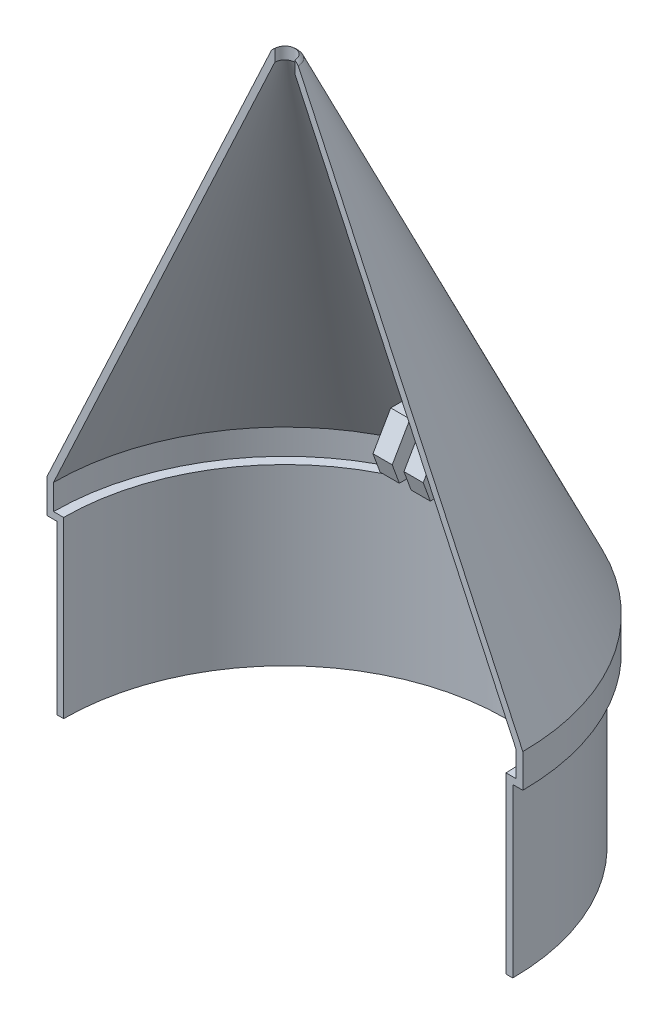
ISO-10303-21;
HEADER;
FILE_DESCRIPTION(('STEP AP214'),'2;1');
FILE_NAME('part.step','',(''),(''),'','','');
FILE_SCHEMA(('AUTOMOTIVE_DESIGN { 1 0 10303 214 1 1 1 1 }'));
ENDSEC;
DATA;
#1=APPLICATION_CONTEXT('core data for automotive mechanical design processes');
#2=APPLICATION_PROTOCOL_DEFINITION('international standard','automotive_design',2000,#1);
#3=PRODUCT_CONTEXT('',#1,'mechanical');
#4=PRODUCT('Part','Part','',(#3));
#5=PRODUCT_RELATED_PRODUCT_CATEGORY('part','',(#4));
#6=PRODUCT_DEFINITION_FORMATION('','',#4);
#7=PRODUCT_DEFINITION_CONTEXT('part definition',#1,'design');
#8=PRODUCT_DEFINITION('design','',#6,#7);
#9=PRODUCT_DEFINITION_SHAPE('','',#8);
#10=(LENGTH_UNIT() NAMED_UNIT(*) SI_UNIT(.MILLI.,.METRE.));
#11=(NAMED_UNIT(*) PLANE_ANGLE_UNIT() SI_UNIT($,.RADIAN.));
#12=(NAMED_UNIT(*) SI_UNIT($,.STERADIAN.) SOLID_ANGLE_UNIT());
#13=UNCERTAINTY_MEASURE_WITH_UNIT(LENGTH_MEASURE(1.E-05),#10,'distance_accuracy_value','');
#14=(GEOMETRIC_REPRESENTATION_CONTEXT(3) GLOBAL_UNCERTAINTY_ASSIGNED_CONTEXT((#13)) GLOBAL_UNIT_ASSIGNED_CONTEXT((#10,
#11,#12)) REPRESENTATION_CONTEXT('',''));
#15=CARTESIAN_POINT('',(0.,0.,0.));
#16=DIRECTION('',(0.,0.,1.));
#17=DIRECTION('',(1.,0.,0.));
#18=AXIS2_PLACEMENT_3D('',#15,#16,#17);
#19=CARTESIAN_POINT('',(7.5,40.,-39.0900744143344));
#20=DIRECTION('',(0.,-0.499999999999997,-0.86602540378444));
#21=DIRECTION('',(0.,0.86602540378444,-0.499999999999997));
#22=AXIS2_PLACEMENT_3D('',#19,#20,#21);
#23=PLANE('',#22);
#24=DIRECTION('',(0.,-0.86602540378444,0.499999999999997));
#25=VECTOR('',#24,1.);
#26=CARTESIAN_POINT('',(-1.75,40.,-39.0900744143344));
#27=LINE('',#26,#25);
#28=CARTESIAN_POINT('',(-1.75,40.,-39.0900744143344));
#29=VERTEX_POINT('',#28);
#30=CARTESIAN_POINT('',(-1.75,30.8217208581525,-33.7909924810913));
#31=VERTEX_POINT('',#30);
#32=EDGE_CURVE('E486',#29,#31,#27,.T.);
#33=ORIENTED_EDGE('',*,*,#32,.F.);
#34=DIRECTION('',(-1.,0.,0.));
#35=VECTOR('',#34,1.);
#36=CARTESIAN_POINT('',(7.5,40.,-39.0900744143344));
#37=LINE('',#36,#35);
#38=CARTESIAN_POINT('',(-7.5,40.,-39.0900744143344));
#39=VERTEX_POINT('',#38);
#40=EDGE_CURVE('E63',#29,#39,#37,.T.);
#41=ORIENTED_EDGE('',*,*,#40,.T.);
#42=DIRECTION('',(0.,-0.86602540378444,0.499999999999997));
#43=VECTOR('',#42,1.);
#44=CARTESIAN_POINT('',(-7.5,40.,-39.0900744143344));
#45=LINE('',#44,#43);
#46=CARTESIAN_POINT('',(-7.5,30.8217208581525,-33.7909924810913));
#47=VERTEX_POINT('',#46);
#48=EDGE_CURVE('E46',#39,#47,#45,.T.);
#49=ORIENTED_EDGE('',*,*,#48,.T.);
#50=DIRECTION('',(-1.,0.,0.));
#51=VECTOR('',#50,1.);
#52=CARTESIAN_POINT('',(7.5,30.8217208581525,-33.7909924810913));
#53=LINE('',#52,#51);
#54=EDGE_CURVE('E126',#31,#47,#53,.T.);
#55=ORIENTED_EDGE('',*,*,#54,.F.);
#56=EDGE_LOOP('',(#33,#41,#49,#55));
#57=FACE_BOUND('',#56,.T.);
#58=ADVANCED_FACE('F37',(#57),#23,.F.);
#59=CARTESIAN_POINT('',(7.5,30.8217208581525,-33.7909924810913));
#60=DIRECTION('',(0.,0.342020143325672,-0.939692620785907));
#61=DIRECTION('',(0.,0.939692620785907,0.342020143325672));
#62=AXIS2_PLACEMENT_3D('',#59,#60,#61);
#63=PLANE('',#62);
#64=DIRECTION('',(0.,-0.939692620785907,-0.342020143325672));
#65=VECTOR('',#64,1.);
#66=CARTESIAN_POINT('',(-1.75,30.8217208581525,-33.7909924810913));
#67=LINE('',#66,#65);
#68=CARTESIAN_POINT('',(-1.75,25.,-35.9099255856655));
#69=VERTEX_POINT('',#68);
#70=EDGE_CURVE('E492',#31,#69,#67,.T.);
#71=ORIENTED_EDGE('',*,*,#70,.F.);
#72=ORIENTED_EDGE('',*,*,#54,.T.);
#73=DIRECTION('',(0.,-0.939692620785907,-0.342020143325672));
#74=VECTOR('',#73,1.);
#75=CARTESIAN_POINT('',(-7.5,30.8217208581525,-33.7909924810913));
#76=LINE('',#75,#74);
#77=CARTESIAN_POINT('',(-7.5,25.,-35.9099255856655));
#78=VERTEX_POINT('',#77);
#79=EDGE_CURVE('E123',#47,#78,#76,.T.);
#80=ORIENTED_EDGE('',*,*,#79,.T.);
#81=DIRECTION('',(-1.,0.,0.));
#82=VECTOR('',#81,1.);
#83=CARTESIAN_POINT('',(7.5,25.,-35.9099255856655));
#84=LINE('',#83,#82);
#85=EDGE_CURVE('E107',#69,#78,#84,.T.);
#86=ORIENTED_EDGE('',*,*,#85,.F.);
#87=EDGE_LOOP('',(#71,#72,#80,#86));
#88=FACE_BOUND('',#87,.T.);
#89=ADVANCED_FACE('F124',(#88),#63,.F.);
#90=CARTESIAN_POINT('',(7.5,25.,-35.9099255856655));
#91=DIRECTION('',(0.,1.,0.));
#92=DIRECTION('',(0.,0.,1.));
#93=AXIS2_PLACEMENT_3D('',#90,#91,#92);
#94=PLANE('',#93);
#95=DIRECTION('',(0.,0.,-1.));
#96=VECTOR('',#95,1.);
#97=CARTESIAN_POINT('',(-1.75,25.,-35.9099255856655));
#98=LINE('',#97,#96);
#99=CARTESIAN_POINT('',(-1.75,25.,-40.9099255856655));
#100=VERTEX_POINT('',#99);
#101=EDGE_CURVE('E116',#69,#100,#98,.T.);
#102=ORIENTED_EDGE('',*,*,#101,.F.);
#103=ORIENTED_EDGE('',*,*,#85,.T.);
#104=DIRECTION('',(0.,0.,-1.));
#105=VECTOR('',#104,1.);
#106=CARTESIAN_POINT('',(-7.5,25.,-35.9099255856655));
#107=LINE('',#106,#105);
#108=CARTESIAN_POINT('',(-7.5,25.,-40.9099255856655));
#109=VERTEX_POINT('',#108);
#110=EDGE_CURVE('E112',#78,#109,#107,.T.);
#111=ORIENTED_EDGE('',*,*,#110,.T.);
#112=DIRECTION('',(-1.,0.,0.));
#113=VECTOR('',#112,1.);
#114=CARTESIAN_POINT('',(7.5,25.,-40.9099255856655));
#115=LINE('',#114,#113);
#116=EDGE_CURVE('E242',#100,#109,#115,.T.);
#117=ORIENTED_EDGE('',*,*,#116,.F.);
#118=EDGE_LOOP('',(#102,#103,#111,#117));
#119=FACE_BOUND('',#118,.T.);
#120=ADVANCED_FACE('F109',(#119),#94,.F.);
#121=CARTESIAN_POINT('',(7.5,25.,-40.9099255856655));
#122=DIRECTION('',(0.,-0.342020143325673,0.939692620785907));
#123=DIRECTION('',(0.,-0.939692620785907,-0.342020143325673));
#124=AXIS2_PLACEMENT_3D('',#121,#122,#123);
#125=PLANE('',#124);
#126=DIRECTION('',(0.,0.939692620785907,0.342020143325673));
#127=VECTOR('',#126,1.);
#128=CARTESIAN_POINT('',(1.75,25.,-40.9099255856655));
#129=LINE('',#128,#127);
#130=CARTESIAN_POINT('',(1.75,25.,-40.9099255856655));
#131=VERTEX_POINT('',#130);
#132=CARTESIAN_POINT('',(1.75,30.,-39.0900744143345));
#133=VERTEX_POINT('',#132);
#134=EDGE_CURVE('E457',#131,#133,#129,.T.);
#135=ORIENTED_EDGE('',*,*,#134,.T.);
#136=DIRECTION('',(-1.,0.,0.));
#137=VECTOR('',#136,1.);
#138=CARTESIAN_POINT('',(7.5,30.,-39.0900744143345));
#139=LINE('',#138,#137);
#140=CARTESIAN_POINT('',(7.5,30.,-39.0900744143345));
#141=VERTEX_POINT('',#140);
#142=EDGE_CURVE('E245',#141,#133,#139,.T.);
#143=ORIENTED_EDGE('',*,*,#142,.F.);
#144=DIRECTION('',(0.,0.939692620785907,0.342020143325673));
#145=VECTOR('',#144,1.);
#146=CARTESIAN_POINT('',(7.5,25.,-40.9099255856655));
#147=LINE('',#146,#145);
#148=CARTESIAN_POINT('',(7.5,25.,-40.9099255856655));
#149=VERTEX_POINT('',#148);
#150=EDGE_CURVE('E140',#149,#141,#147,.T.);
#151=ORIENTED_EDGE('',*,*,#150,.F.);
#152=EDGE_CURVE('E243',#149,#131,#115,.T.);
#153=ORIENTED_EDGE('',*,*,#152,.T.);
#154=EDGE_LOOP('',(#135,#143,#151,#153));
#155=FACE_BOUND('',#154,.T.);
#156=ADVANCED_FACE('F197',(#155),#125,.F.);
#157=CARTESIAN_POINT('',(0.,10.,0.));
#158=DIRECTION('',(0.,-1.,0.));
#159=DIRECTION('',(0.,0.,-1.));
#160=AXIS2_PLACEMENT_3D('',#157,#158,#159);
#161=CONICAL_SURFACE('',#160,71.,0.436332312998576);
#162=CARTESIAN_POINT('',(0.,10.,0.));
#163=DIRECTION('',(0.,-1.,0.));
#164=DIRECTION('',(0.,0.,-1.));
#165=AXIS2_PLACEMENT_3D('',#162,#163,#164);
#166=CIRCLE('',#165,71.);
#167=CARTESIAN_POINT('',(-71.,10.0000000000001,0.));
#168=VERTEX_POINT('',#167);
#169=CARTESIAN_POINT('',(71.,10.,0.));
#170=VERTEX_POINT('',#169);
#171=EDGE_CURVE('E442',#168,#170,#166,.T.);
#172=ORIENTED_EDGE('',*,*,#171,.F.);
#173=DIRECTION('',(-0.422618261740694,-0.906307787036652,0.));
#174=VECTOR('',#173,1.);
#175=CARTESIAN_POINT('',(-71.,10.0000000000001,0.));
#176=LINE('',#175,#174);
#177=CARTESIAN_POINT('',(-4.00000000000004,153.681963674143,0.));
#178=VERTEX_POINT('',#177);
#179=EDGE_CURVE('E341',#178,#168,#176,.T.);
#180=ORIENTED_EDGE('',*,*,#179,.F.);
#181=CARTESIAN_POINT('',(0.,153.681963674143,0.));
#182=DIRECTION('',(0.,-1.,0.));
#183=DIRECTION('',(0.,0.,-1.));
#184=AXIS2_PLACEMENT_3D('',#181,#182,#183);
#185=CIRCLE('',#184,4.);
#186=CARTESIAN_POINT('',(4.,153.681963674143,0.));
#187=VERTEX_POINT('',#186);
#188=EDGE_CURVE('E339',#178,#187,#185,.T.);
#189=ORIENTED_EDGE('',*,*,#188,.T.);
#190=DIRECTION('',(-0.422618261740694,0.906307787036652,0.));
#191=VECTOR('',#190,1.);
#192=CARTESIAN_POINT('',(4.,153.681963674143,0.));
#193=LINE('',#192,#191);
#194=EDGE_CURVE('E370',#170,#187,#193,.T.);
#195=ORIENTED_EDGE('',*,*,#194,.F.);
#196=EDGE_LOOP('',(#172,#180,#189,#195));
#197=FACE_BOUND('',#196,.T.);
#198=ADVANCED_FACE('F194',(#197),#161,.T.);
#199=CARTESIAN_POINT('',(0.,150.681963674143,0.));
#200=DIRECTION('',(0.,-1.,0.));
#201=DIRECTION('',(1.,0.,0.));
#202=AXIS2_PLACEMENT_3D('',#199,#200,#201);
#203=SPHERICAL_SURFACE('',#202,5.);
#204=ORIENTED_EDGE('',*,*,#188,.F.);
#205=CARTESIAN_POINT('',(0.,150.681963674143,0.));
#206=DIRECTION('',(0.,0.,1.));
#207=DIRECTION('',(1.,0.,0.));
#208=AXIS2_PLACEMENT_3D('',#205,#206,#207);
#209=CIRCLE('',#208,5.);
#210=CARTESIAN_POINT('',(-3.,154.681963674143,0.));
#211=VERTEX_POINT('',#210);
#212=EDGE_CURVE('E322',#211,#178,#209,.T.);
#213=ORIENTED_EDGE('',*,*,#212,.F.);
#214=CARTESIAN_POINT('',(0.,154.681963674143,0.));
#215=DIRECTION('',(0.,-1.,0.));
#216=DIRECTION('',(0.,0.,-1.));
#217=AXIS2_PLACEMENT_3D('',#214,#215,#216);
#218=CIRCLE('',#217,3.);
#219=CARTESIAN_POINT('',(3.,154.681963674143,0.));
#220=VERTEX_POINT('',#219);
#221=EDGE_CURVE('E337',#211,#220,#218,.T.);
#222=ORIENTED_EDGE('',*,*,#221,.T.);
#223=CARTESIAN_POINT('',(0.,150.681963674143,0.));
#224=DIRECTION('',(0.,0.,1.));
#225=DIRECTION('',(1.,0.,0.));
#226=AXIS2_PLACEMENT_3D('',#223,#224,#225);
#227=CIRCLE('',#226,5.);
#228=EDGE_CURVE('E340',#187,#220,#227,.T.);
#229=ORIENTED_EDGE('',*,*,#228,.F.);
#230=EDGE_LOOP('',(#204,#213,#222,#229));
#231=FACE_BOUND('',#230,.T.);
#232=ADVANCED_FACE('F196',(#231),#203,.T.);
#233=CARTESIAN_POINT('',(0.,9.15476347651861,0.));
#234=DIRECTION('',(0.,-1.,0.));
#235=DIRECTION('',(0.,0.,-1.));
#236=AXIS2_PLACEMENT_3D('',#233,#234,#235);
#237=CONICAL_SURFACE('',#236,69.1873844259267,0.436332312998576);
#238=CARTESIAN_POINT('',(0.,40.,0.));
#239=DIRECTION('',(0.,-1.,0.));
#240=DIRECTION('',(0.,0.,-1.));
#241=AXIS2_PLACEMENT_3D('',#238,#239,#240);
#242=CIRCLE('',#241,54.8040144174253);
#243=CARTESIAN_POINT('',(7.5,40.,-54.2883965158795));
#244=VERTEX_POINT('',#243);
#245=CARTESIAN_POINT('',(-7.5,40.,-54.2883965158795));
#246=VERTEX_POINT('',#245);
#247=EDGE_CURVE('E389',#244,#246,#242,.F.);
#248=ORIENTED_EDGE('',*,*,#247,.F.);
#249=CARTESIAN_POINT('',(7.5,71.6617471357174,-39.3312030396811));
#250=CARTESIAN_POINT('',(7.5,69.5429095750306,-40.3370124449023));
#251=CARTESIAN_POINT('',(7.5,67.4235666533207,-41.3417563847066));
#252=CARTESIAN_POINT('',(7.5,63.1840370711939,-43.3494614588628));
#253=CARTESIAN_POINT('',(7.5,61.0638504109723,-44.3524225936273));
#254=CARTESIAN_POINT('',(7.5,56.8228008436297,-46.356909944387));
#255=CARTESIAN_POINT('',(7.5,54.7019379369846,-47.3584361613897));
#256=CARTESIAN_POINT('',(7.5,50.4596494974675,-49.3602965685943));
#257=CARTESIAN_POINT('',(7.5,48.3382239645579,-50.3606307587166));
#258=CARTESIAN_POINT('',(7.5,41.9732550529254,-53.3601475533498));
#259=CARTESIAN_POINT('',(7.5,37.7290129380292,-55.3578474164361));
#260=CARTESIAN_POINT('',(7.5,29.2391956597101,-59.3504138622749));
#261=CARTESIAN_POINT('',(7.5,24.9936204960364,-61.3452804444937));
#262=CARTESIAN_POINT('',(7.5,18.4639218677366,-64.4113980588905));
#263=CARTESIAN_POINT('',(7.5,16.1801520127968,-65.4834022526316));
#264=CARTESIAN_POINT('',(7.5,11.6123630399049,-67.6268789781934));
#265=CARTESIAN_POINT('',(7.5,9.32834392197285,-68.698351510057));
#266=CARTESIAN_POINT('',(7.5,4.76008800791667,-70.840836880328));
#267=CARTESIAN_POINT('',(7.5,2.47585121163027,-71.9118497183893));
#268=CARTESIAN_POINT('',(7.5,-2.09281220832437,-74.053470877222));
#269=CARTESIAN_POINT('',(7.5,-4.37723883200638,-75.1240791979639));
#270=CARTESIAN_POINT('',(7.5,-6.66174713571736,-76.1945131729994));
#271=B_SPLINE_CURVE_WITH_KNOTS('',3,(#249,#250,#251,#252,#253,#254,#255,#256,#257,#258,#259,
#260,#261,#262,#263,#264,#265,#266,#267,#268,#269,#270),.UNSPECIFIED.,.F.,.F.,(4,2,2,2,2,2,2,2,
2,2,4),(0.,7.0363424264071,14.0726832244328,21.1090190805746,28.1453554066432,42.2180067470829,
56.2906607385882,63.8592259098191,71.4277904690593,78.9963607140983,86.5649315093623),.UNSPECIFIED.);
#272=CARTESIAN_POINT('',(7.5,30.,-58.9922445062094));
#273=VERTEX_POINT('',#272);
#274=EDGE_CURVE('E163',#244,#273,#271,.T.);
#275=ORIENTED_EDGE('',*,*,#274,.T.);
#276=CARTESIAN_POINT('',(0.,30.,0.));
#277=DIRECTION('',(0.,1.,0.));
#278=DIRECTION('',(0.,0.,1.));
#279=AXIS2_PLACEMENT_3D('',#276,#277,#278);
#280=CIRCLE('',#279,59.4670909989752);
#281=CARTESIAN_POINT('',(-7.5,30.,-58.9922445062094));
#282=VERTEX_POINT('',#281);
#283=EDGE_CURVE('E153',#282,#273,#280,.F.);
#284=ORIENTED_EDGE('',*,*,#283,.F.);
#285=CARTESIAN_POINT('',(-7.5,71.6617471357174,-39.3312030396811));
#286=CARTESIAN_POINT('',(-7.5,69.5429095750306,-40.3370124449023));
#287=CARTESIAN_POINT('',(-7.5,67.4235666533207,-41.3417563847066));
#288=CARTESIAN_POINT('',(-7.5,63.1840370711939,-43.3494614588628));
#289=CARTESIAN_POINT('',(-7.5,61.0638504109723,-44.3524225936273));
#290=CARTESIAN_POINT('',(-7.5,56.8228008436297,-46.356909944387));
#291=CARTESIAN_POINT('',(-7.5,54.7019379369846,-47.3584361613897));
#292=CARTESIAN_POINT('',(-7.5,50.4596494974675,-49.3602965685943));
#293=CARTESIAN_POINT('',(-7.5,48.3382239645579,-50.3606307587166));
#294=CARTESIAN_POINT('',(-7.5,41.9732550529254,-53.3601475533498));
#295=CARTESIAN_POINT('',(-7.5,37.7290129380292,-55.3578474164361));
#296=CARTESIAN_POINT('',(-7.5,29.2391956597101,-59.3504138622749));
#297=CARTESIAN_POINT('',(-7.5,24.9936204960364,-61.3452804444937));
#298=CARTESIAN_POINT('',(-7.5,18.4639218677366,-64.4113980588905));
#299=CARTESIAN_POINT('',(-7.5,16.1801520127968,-65.4834022526316));
#300=CARTESIAN_POINT('',(-7.5,11.6123630399049,-67.6268789781934));
#301=CARTESIAN_POINT('',(-7.5,9.32834392197285,-68.698351510057));
#302=CARTESIAN_POINT('',(-7.5,4.76008800791667,-70.840836880328));
#303=CARTESIAN_POINT('',(-7.5,2.47585121163027,-71.9118497183893));
#304=CARTESIAN_POINT('',(-7.5,-2.09281220832437,-74.053470877222));
#305=CARTESIAN_POINT('',(-7.5,-4.37723883200638,-75.1240791979639));
#306=CARTESIAN_POINT('',(-7.5,-6.66174713571736,-76.1945131729994));
#307=B_SPLINE_CURVE_WITH_KNOTS('',3,(#285,#286,#287,#288,#289,#290,#291,#292,#293,#294,#295,
#296,#297,#298,#299,#300,#301,#302,#303,#304,#305,#306),.UNSPECIFIED.,.F.,.F.,(4,2,2,2,2,2,2,2,
2,2,4),(0.,7.0363424264071,14.0726832244328,21.1090190805746,28.1453554066432,42.2180067470829,
56.2906607385882,63.8592259098191,71.4277904690593,78.9963607140983,86.5649315093623),.UNSPECIFIED.);
#308=EDGE_CURVE('E158',#246,#282,#307,.T.);
#309=ORIENTED_EDGE('',*,*,#308,.F.);
#310=EDGE_LOOP('',(#248,#275,#284,#309));
#311=FACE_BOUND('',#310,.T.);
#312=DIRECTION('',(-0.422618261740694,-0.906307787036653,0.));
#313=VECTOR('',#312,1.);
#314=CARTESIAN_POINT('',(0.,157.527588189876,0.));
#315=LINE('',#314,#313);
#316=CARTESIAN_POINT('',(-69.,9.55661067471414,0.));
#317=VERTEX_POINT('',#316);
#318=CARTESIAN_POINT('',(-3.,151.094067428347,0.));
#319=VERTEX_POINT('',#318);
#320=EDGE_CURVE('E325',#317,#319,#315,.F.);
#321=ORIENTED_EDGE('',*,*,#320,.F.);
#322=CARTESIAN_POINT('',(0.,9.55661067471413,0.));
#323=DIRECTION('',(0.,-1.,0.));
#324=DIRECTION('',(0.,0.,-1.));
#325=AXIS2_PLACEMENT_3D('',#322,#323,#324);
#326=CIRCLE('',#325,69.);
#327=CARTESIAN_POINT('',(69.,9.55661067471414,0.));
#328=VERTEX_POINT('',#327);
#329=EDGE_CURVE('E355',#317,#328,#326,.T.);
#330=ORIENTED_EDGE('',*,*,#329,.T.);
#331=DIRECTION('',(-0.422618261740694,0.906307787036653,0.));
#332=VECTOR('',#331,1.);
#333=CARTESIAN_POINT('',(0.,157.527588189876,0.));
#334=LINE('',#333,#332);
#335=CARTESIAN_POINT('',(3.,151.094067428347,0.));
#336=VERTEX_POINT('',#335);
#337=EDGE_CURVE('E368',#336,#328,#334,.F.);
#338=ORIENTED_EDGE('',*,*,#337,.F.);
#339=CARTESIAN_POINT('',(0.,151.094067428347,0.));
#340=DIRECTION('',(0.,-1.,0.));
#341=DIRECTION('',(0.,0.,-1.));
#342=AXIS2_PLACEMENT_3D('',#339,#340,#341);
#343=CIRCLE('',#342,3.);
#344=EDGE_CURVE('E345',#319,#336,#343,.T.);
#345=ORIENTED_EDGE('',*,*,#344,.F.);
#346=EDGE_LOOP('',(#321,#330,#338,#345));
#347=FACE_BOUND('',#346,.T.);
#348=ADVANCED_FACE('F182',(#311,#347),#237,.F.);
#349=CARTESIAN_POINT('',(0.,-50.,0.));
#350=DIRECTION('',(0.,-1.,0.));
#351=DIRECTION('',(0.,0.,-1.));
#352=AXIS2_PLACEMENT_3D('',#349,#350,#351);
#353=PLANE('',#352);
#354=CARTESIAN_POINT('',(0.,-50.,0.));
#355=DIRECTION('',(0.,-1.,0.));
#356=DIRECTION('',(0.,0.,-1.));
#357=AXIS2_PLACEMENT_3D('',#354,#355,#356);
#358=CIRCLE('',#357,68.);
#359=CARTESIAN_POINT('',(-68.,-50.,0.));
#360=VERTEX_POINT('',#359);
#361=CARTESIAN_POINT('',(68.,-50.,0.));
#362=VERTEX_POINT('',#361);
#363=EDGE_CURVE('E403',#360,#362,#358,.T.);
#364=ORIENTED_EDGE('',*,*,#363,.T.);
#365=DIRECTION('',(1.,0.,0.));
#366=VECTOR('',#365,1.);
#367=CARTESIAN_POINT('',(68.,-50.,0.));
#368=LINE('',#367,#366);
#369=CARTESIAN_POINT('',(66.,-50.,0.));
#370=VERTEX_POINT('',#369);
#371=EDGE_CURVE('E380',#370,#362,#368,.T.);
#372=ORIENTED_EDGE('',*,*,#371,.F.);
#373=CARTESIAN_POINT('',(0.,-50.,0.));
#374=DIRECTION('',(0.,-1.,0.));
#375=DIRECTION('',(0.,0.,-1.));
#376=AXIS2_PLACEMENT_3D('',#373,#374,#375);
#377=CIRCLE('',#376,66.);
#378=CARTESIAN_POINT('',(-66.,-50.,0.));
#379=VERTEX_POINT('',#378);
#380=EDGE_CURVE('E346',#379,#370,#377,.T.);
#381=ORIENTED_EDGE('',*,*,#380,.F.);
#382=EDGE_CURVE('E378',#360,#379,#368,.T.);
#383=ORIENTED_EDGE('',*,*,#382,.F.);
#384=EDGE_LOOP('',(#364,#372,#381,#383));
#385=FACE_BOUND('',#384,.T.);
#386=ADVANCED_FACE('F392',(#385),#353,.T.);
#387=CARTESIAN_POINT('',(0.,0.,0.));
#388=DIRECTION('',(0.,-1.,0.));
#389=DIRECTION('',(0.,0.,-1.));
#390=AXIS2_PLACEMENT_3D('',#387,#388,#389);
#391=CYLINDRICAL_SURFACE('',#390,71.);
#392=CARTESIAN_POINT('',(0.,0.,0.));
#393=DIRECTION('',(0.,-1.,0.));
#394=DIRECTION('',(0.,0.,-1.));
#395=AXIS2_PLACEMENT_3D('',#392,#393,#394);
#396=CIRCLE('',#395,71.);
#397=CARTESIAN_POINT('',(-71.,0.,0.));
#398=VERTEX_POINT('',#397);
#399=CARTESIAN_POINT('',(71.,0.,0.));
#400=VERTEX_POINT('',#399);
#401=EDGE_CURVE('E412',#398,#400,#396,.T.);
#402=ORIENTED_EDGE('',*,*,#401,.F.);
#403=DIRECTION('',(0.,-1.,0.));
#404=VECTOR('',#403,1.);
#405=CARTESIAN_POINT('',(-71.,0.,0.));
#406=LINE('',#405,#404);
#407=EDGE_CURVE('E385',#168,#398,#406,.T.);
#408=ORIENTED_EDGE('',*,*,#407,.F.);
#409=ORIENTED_EDGE('',*,*,#171,.T.);
#410=DIRECTION('',(0.,1.,0.));
#411=VECTOR('',#410,1.);
#412=CARTESIAN_POINT('',(71.,10.,0.));
#413=LINE('',#412,#411);
#414=EDGE_CURVE('E372',#400,#170,#413,.T.);
#415=ORIENTED_EDGE('',*,*,#414,.F.);
#416=EDGE_LOOP('',(#402,#408,#409,#415));
#417=FACE_BOUND('',#416,.T.);
#418=ADVANCED_FACE('F590',(#417),#391,.T.);
#419=CARTESIAN_POINT('',(68.,0.,0.));
#420=DIRECTION('',(0.,-1.,0.));
#421=DIRECTION('',(0.,0.,-1.));
#422=AXIS2_PLACEMENT_3D('',#419,#420,#421);
#423=PLANE('',#422);
#424=ORIENTED_EDGE('',*,*,#401,.T.);
#425=DIRECTION('',(1.,0.,0.));
#426=VECTOR('',#425,1.);
#427=CARTESIAN_POINT('',(71.,0.,0.));
#428=LINE('',#427,#426);
#429=CARTESIAN_POINT('',(68.,0.,0.));
#430=VERTEX_POINT('',#429);
#431=EDGE_CURVE('E374',#430,#400,#428,.T.);
#432=ORIENTED_EDGE('',*,*,#431,.F.);
#433=CARTESIAN_POINT('',(0.,0.,0.));
#434=DIRECTION('',(0.,-1.,0.));
#435=DIRECTION('',(0.,0.,-1.));
#436=AXIS2_PLACEMENT_3D('',#433,#434,#435);
#437=CIRCLE('',#436,68.);
#438=CARTESIAN_POINT('',(-68.,0.,0.));
#439=VERTEX_POINT('',#438);
#440=EDGE_CURVE('E405',#439,#430,#437,.T.);
#441=ORIENTED_EDGE('',*,*,#440,.F.);
#442=DIRECTION('',(1.,0.,0.));
#443=VECTOR('',#442,1.);
#444=CARTESIAN_POINT('',(-68.,0.,0.));
#445=LINE('',#444,#443);
#446=EDGE_CURVE('E383',#398,#439,#445,.T.);
#447=ORIENTED_EDGE('',*,*,#446,.F.);
#448=EDGE_LOOP('',(#424,#432,#441,#447));
#449=FACE_BOUND('',#448,.T.);
#450=ADVANCED_FACE('F437',(#449),#423,.T.);
#451=CARTESIAN_POINT('',(0.,0.,0.));
#452=DIRECTION('',(0.,-1.,0.));
#453=DIRECTION('',(0.,0.,-1.));
#454=AXIS2_PLACEMENT_3D('',#451,#452,#453);
#455=CYLINDRICAL_SURFACE('',#454,68.);
#456=ORIENTED_EDGE('',*,*,#363,.F.);
#457=DIRECTION('',(0.,-1.,0.));
#458=VECTOR('',#457,1.);
#459=CARTESIAN_POINT('',(-68.,-50.,0.));
#460=LINE('',#459,#458);
#461=EDGE_CURVE('E381',#439,#360,#460,.T.);
#462=ORIENTED_EDGE('',*,*,#461,.F.);
#463=ORIENTED_EDGE('',*,*,#440,.T.);
#464=DIRECTION('',(0.,1.,0.));
#465=VECTOR('',#464,1.);
#466=CARTESIAN_POINT('',(68.,0.,0.));
#467=LINE('',#466,#465);
#468=EDGE_CURVE('E376',#362,#430,#467,.T.);
#469=ORIENTED_EDGE('',*,*,#468,.F.);
#470=EDGE_LOOP('',(#456,#462,#463,#469));
#471=FACE_BOUND('',#470,.T.);
#472=ADVANCED_FACE('F431',(#471),#455,.T.);
#473=CARTESIAN_POINT('',(0.,0.,0.));
#474=DIRECTION('',(0.,-1.,0.));
#475=DIRECTION('',(0.,0.,-1.));
#476=AXIS2_PLACEMENT_3D('',#473,#474,#475);
#477=CYLINDRICAL_SURFACE('',#476,69.);
#478=DIRECTION('',(0.,-1.,0.));
#479=VECTOR('',#478,1.);
#480=CARTESIAN_POINT('',(-69.,0.,0.));
#481=LINE('',#480,#479);
#482=CARTESIAN_POINT('',(-69.,2.,0.));
#483=VERTEX_POINT('',#482);
#484=EDGE_CURVE('E359',#483,#317,#481,.F.);
#485=ORIENTED_EDGE('',*,*,#484,.F.);
#486=CARTESIAN_POINT('',(0.,2.,0.));
#487=DIRECTION('',(0.,-1.,0.));
#488=DIRECTION('',(0.,0.,-1.));
#489=AXIS2_PLACEMENT_3D('',#486,#487,#488);
#490=CIRCLE('',#489,69.);
#491=CARTESIAN_POINT('',(69.,2.,0.));
#492=VERTEX_POINT('',#491);
#493=EDGE_CURVE('E402',#483,#492,#490,.T.);
#494=ORIENTED_EDGE('',*,*,#493,.T.);
#495=DIRECTION('',(0.,-1.,0.));
#496=VECTOR('',#495,1.);
#497=CARTESIAN_POINT('',(69.,0.,0.));
#498=LINE('',#497,#496);
#499=EDGE_CURVE('E366',#328,#492,#498,.T.);
#500=ORIENTED_EDGE('',*,*,#499,.F.);
#501=ORIENTED_EDGE('',*,*,#329,.F.);
#502=EDGE_LOOP('',(#485,#494,#500,#501));
#503=FACE_BOUND('',#502,.T.);
#504=ADVANCED_FACE('F399',(#503),#477,.F.);
#505=CARTESIAN_POINT('',(68.,2.,0.));
#506=DIRECTION('',(0.,-1.,0.));
#507=DIRECTION('',(0.,0.,-1.));
#508=AXIS2_PLACEMENT_3D('',#505,#506,#507);
#509=PLANE('',#508);
#510=DIRECTION('',(-1.,0.,0.));
#511=VECTOR('',#510,1.);
#512=CARTESIAN_POINT('',(68.,2.,0.));
#513=LINE('',#512,#511);
#514=CARTESIAN_POINT('',(66.,2.,0.));
#515=VERTEX_POINT('',#514);
#516=EDGE_CURVE('E364',#492,#515,#513,.T.);
#517=ORIENTED_EDGE('',*,*,#516,.F.);
#518=ORIENTED_EDGE('',*,*,#493,.F.);
#519=CARTESIAN_POINT('',(-66.,2.,0.));
#520=VERTEX_POINT('',#519);
#521=EDGE_CURVE('E358',#520,#483,#513,.T.);
#522=ORIENTED_EDGE('',*,*,#521,.F.);
#523=CARTESIAN_POINT('',(0.,2.,0.));
#524=DIRECTION('',(0.,-1.,0.));
#525=DIRECTION('',(0.,0.,-1.));
#526=AXIS2_PLACEMENT_3D('',#523,#524,#525);
#527=CIRCLE('',#526,66.);
#528=EDGE_CURVE('E351',#520,#515,#527,.T.);
#529=ORIENTED_EDGE('',*,*,#528,.T.);
#530=EDGE_LOOP('',(#517,#518,#522,#529));
#531=FACE_BOUND('',#530,.T.);
#532=ADVANCED_FACE('F421',(#531),#509,.F.);
#533=CARTESIAN_POINT('',(0.,0.,0.));
#534=DIRECTION('',(0.,-1.,0.));
#535=DIRECTION('',(0.,0.,-1.));
#536=AXIS2_PLACEMENT_3D('',#533,#534,#535);
#537=CYLINDRICAL_SURFACE('',#536,66.);
#538=DIRECTION('',(0.,-1.,0.));
#539=VECTOR('',#538,1.);
#540=CARTESIAN_POINT('',(-66.,0.,0.));
#541=LINE('',#540,#539);
#542=EDGE_CURVE('E348',#379,#520,#541,.F.);
#543=ORIENTED_EDGE('',*,*,#542,.F.);
#544=ORIENTED_EDGE('',*,*,#380,.T.);
#545=DIRECTION('',(0.,-1.,0.));
#546=VECTOR('',#545,1.);
#547=CARTESIAN_POINT('',(66.,0.,0.));
#548=LINE('',#547,#546);
#549=EDGE_CURVE('E362',#515,#370,#548,.T.);
#550=ORIENTED_EDGE('',*,*,#549,.F.);
#551=ORIENTED_EDGE('',*,*,#528,.F.);
#552=EDGE_LOOP('',(#543,#544,#550,#551));
#553=FACE_BOUND('',#552,.T.);
#554=ADVANCED_FACE('F425',(#553),#537,.F.);
#555=CARTESIAN_POINT('',(0.,155.681963674143,0.));
#556=DIRECTION('',(0.,-1.,0.));
#557=DIRECTION('',(0.,0.,-1.));
#558=AXIS2_PLACEMENT_3D('',#555,#556,#557);
#559=CYLINDRICAL_SURFACE('',#558,3.);
#560=ORIENTED_EDGE('',*,*,#221,.F.);
#561=DIRECTION('',(0.,-1.,0.));
#562=VECTOR('',#561,1.);
#563=CARTESIAN_POINT('',(-3.,155.681963674143,0.));
#564=LINE('',#563,#562);
#565=EDGE_CURVE('E320',#211,#319,#564,.T.);
#566=ORIENTED_EDGE('',*,*,#565,.T.);
#567=ORIENTED_EDGE('',*,*,#344,.T.);
#568=DIRECTION('',(0.,-1.,0.));
#569=VECTOR('',#568,1.);
#570=CARTESIAN_POINT('',(3.,155.681963674143,0.));
#571=LINE('',#570,#569);
#572=EDGE_CURVE('E330',#336,#220,#571,.F.);
#573=ORIENTED_EDGE('',*,*,#572,.T.);
#574=EDGE_LOOP('',(#560,#566,#567,#573));
#575=FACE_BOUND('',#574,.T.);
#576=ADVANCED_FACE('F344',(#575),#559,.F.);
#577=CARTESIAN_POINT('',(0.,150.681963674143,0.));
#578=DIRECTION('',(0.,0.,1.));
#579=DIRECTION('',(1.,0.,0.));
#580=AXIS2_PLACEMENT_3D('',#577,#578,#579);
#581=PLANE('',#580);
#582=ORIENTED_EDGE('',*,*,#549,.T.);
#583=ORIENTED_EDGE('',*,*,#371,.T.);
#584=ORIENTED_EDGE('',*,*,#468,.T.);
#585=ORIENTED_EDGE('',*,*,#431,.T.);
#586=ORIENTED_EDGE('',*,*,#414,.T.);
#587=ORIENTED_EDGE('',*,*,#194,.T.);
#588=ORIENTED_EDGE('',*,*,#228,.T.);
#589=ORIENTED_EDGE('',*,*,#572,.F.);
#590=ORIENTED_EDGE('',*,*,#337,.T.);
#591=ORIENTED_EDGE('',*,*,#499,.T.);
#592=ORIENTED_EDGE('',*,*,#516,.T.);
#593=EDGE_LOOP('',(#582,#583,#584,#585,#586,#587,#588,#589,#590,#591,#592));
#594=FACE_BOUND('',#593,.T.);
#595=ADVANCED_FACE('F210',(#594),#581,.T.);
#596=ORIENTED_EDGE('',*,*,#542,.T.);
#597=ORIENTED_EDGE('',*,*,#521,.T.);
#598=ORIENTED_EDGE('',*,*,#484,.T.);
#599=ORIENTED_EDGE('',*,*,#320,.T.);
#600=ORIENTED_EDGE('',*,*,#565,.F.);
#601=ORIENTED_EDGE('',*,*,#212,.T.);
#602=ORIENTED_EDGE('',*,*,#179,.T.);
#603=ORIENTED_EDGE('',*,*,#407,.T.);
#604=ORIENTED_EDGE('',*,*,#446,.T.);
#605=ORIENTED_EDGE('',*,*,#461,.T.);
#606=ORIENTED_EDGE('',*,*,#382,.T.);
#607=EDGE_LOOP('',(#596,#597,#598,#599,#600,#601,#602,#603,#604,#605,#606));
#608=FACE_BOUND('',#607,.T.);
#609=ADVANCED_FACE('F204',(#608),#581,.T.);
#610=CARTESIAN_POINT('',(7.5,40.,-57.0107702553503));
#611=DIRECTION('',(0.,-1.,0.));
#612=DIRECTION('',(0.,0.,-1.));
#613=AXIS2_PLACEMENT_3D('',#610,#611,#612);
#614=PLANE('',#613);
#615=DIRECTION('',(1.,0.,0.));
#616=VECTOR('',#615,1.);
#617=CARTESIAN_POINT('',(-1.75,40.,-54.2883965158795));
#618=LINE('',#617,#616);
#619=CARTESIAN_POINT('',(-1.75,40.,-54.2883965158795));
#620=VERTEX_POINT('',#619);
#621=CARTESIAN_POINT('',(1.75,40.,-54.2883965158795));
#622=VERTEX_POINT('',#621);
#623=EDGE_CURVE('E550',#620,#622,#618,.T.);
#624=ORIENTED_EDGE('',*,*,#623,.T.);
#625=DIRECTION('',(0.,0.,1.));
#626=VECTOR('',#625,1.);
#627=CARTESIAN_POINT('',(1.75,40.,-54.2883965158795));
#628=LINE('',#627,#626);
#629=CARTESIAN_POINT('',(1.75,40.,-39.0900744143344));
#630=VERTEX_POINT('',#629);
#631=EDGE_CURVE('E450',#622,#630,#628,.T.);
#632=ORIENTED_EDGE('',*,*,#631,.T.);
#633=CARTESIAN_POINT('',(7.5,40.,-39.0900744143344));
#634=VERTEX_POINT('',#633);
#635=EDGE_CURVE('E165',#634,#630,#37,.T.);
#636=ORIENTED_EDGE('',*,*,#635,.F.);
#637=DIRECTION('',(0.,0.,1.));
#638=VECTOR('',#637,1.);
#639=CARTESIAN_POINT('',(7.5,40.,-57.0107702553503));
#640=LINE('',#639,#638);
#641=EDGE_CURVE('E87',#244,#634,#640,.T.);
#642=ORIENTED_EDGE('',*,*,#641,.F.);
#643=ORIENTED_EDGE('',*,*,#247,.T.);
#644=DIRECTION('',(0.,0.,1.));
#645=VECTOR('',#644,1.);
#646=CARTESIAN_POINT('',(-7.5,40.,-57.0107702553503));
#647=LINE('',#646,#645);
#648=EDGE_CURVE('E11',#246,#39,#647,.T.);
#649=ORIENTED_EDGE('',*,*,#648,.T.);
#650=ORIENTED_EDGE('',*,*,#40,.F.);
#651=DIRECTION('',(0.,0.,1.));
#652=VECTOR('',#651,1.);
#653=CARTESIAN_POINT('',(-1.75,40.,-54.2883965158795));
#654=LINE('',#653,#652);
#655=EDGE_CURVE('E493',#620,#29,#654,.T.);
#656=ORIENTED_EDGE('',*,*,#655,.F.);
#657=EDGE_LOOP('',(#624,#632,#636,#642,#643,#649,#650,#656));
#658=FACE_BOUND('',#657,.T.);
#659=ADVANCED_FACE('F202',(#658),#614,.F.);
#660=CARTESIAN_POINT('',(7.5,30.,-39.0900744143345));
#661=DIRECTION('',(0.,1.,0.));
#662=DIRECTION('',(0.,0.,1.));
#663=AXIS2_PLACEMENT_3D('',#660,#661,#662);
#664=PLANE('',#663);
#665=DIRECTION('',(1.,0.,0.));
#666=VECTOR('',#665,1.);
#667=CARTESIAN_POINT('',(-1.75,30.,-58.9922445062094));
#668=LINE('',#667,#666);
#669=CARTESIAN_POINT('',(-1.75,30.,-58.9922445062094));
#670=VERTEX_POINT('',#669);
#671=CARTESIAN_POINT('',(1.75,30.,-58.9922445062094));
#672=VERTEX_POINT('',#671);
#673=EDGE_CURVE('E331',#670,#672,#668,.T.);
#674=ORIENTED_EDGE('',*,*,#673,.F.);
#675=DIRECTION('',(0.,0.,-1.));
#676=VECTOR('',#675,1.);
#677=CARTESIAN_POINT('',(-1.75,30.,-39.0900744143345));
#678=LINE('',#677,#676);
#679=CARTESIAN_POINT('',(-1.75,30.,-39.0900744143345));
#680=VERTEX_POINT('',#679);
#681=EDGE_CURVE('E500',#680,#670,#678,.T.);
#682=ORIENTED_EDGE('',*,*,#681,.F.);
#683=CARTESIAN_POINT('',(-7.5,30.,-39.0900744143345));
#684=VERTEX_POINT('',#683);
#685=EDGE_CURVE('E96',#680,#684,#139,.T.);
#686=ORIENTED_EDGE('',*,*,#685,.T.);
#687=DIRECTION('',(0.,0.,-1.));
#688=VECTOR('',#687,1.);
#689=CARTESIAN_POINT('',(-7.5,30.,-39.0900744143345));
#690=LINE('',#689,#688);
#691=EDGE_CURVE('E135',#684,#282,#690,.T.);
#692=ORIENTED_EDGE('',*,*,#691,.T.);
#693=ORIENTED_EDGE('',*,*,#283,.T.);
#694=DIRECTION('',(0.,0.,-1.));
#695=VECTOR('',#694,1.);
#696=CARTESIAN_POINT('',(7.5,30.,-39.0900744143345));
#697=LINE('',#696,#695);
#698=EDGE_CURVE('E41',#141,#273,#697,.T.);
#699=ORIENTED_EDGE('',*,*,#698,.F.);
#700=ORIENTED_EDGE('',*,*,#142,.T.);
#701=DIRECTION('',(0.,0.,-1.));
#702=VECTOR('',#701,1.);
#703=CARTESIAN_POINT('',(1.75,30.,-39.0900744143345));
#704=LINE('',#703,#702);
#705=EDGE_CURVE('E54',#133,#672,#704,.T.);
#706=ORIENTED_EDGE('',*,*,#705,.T.);
#707=EDGE_LOOP('',(#674,#682,#686,#692,#693,#699,#700,#706));
#708=FACE_BOUND('',#707,.T.);
#709=ADVANCED_FACE('F39',(#708),#664,.F.);
#710=CARTESIAN_POINT('',(7.5,0.,0.));
#711=DIRECTION('',(1.,0.,0.));
#712=DIRECTION('',(0.,0.,-1.));
#713=AXIS2_PLACEMENT_3D('',#710,#711,#712);
#714=PLANE('',#713);
#715=ORIENTED_EDGE('',*,*,#274,.F.);
#716=ORIENTED_EDGE('',*,*,#641,.T.);
#717=DIRECTION('',(0.,-0.86602540378444,0.499999999999997));
#718=VECTOR('',#717,1.);
#719=CARTESIAN_POINT('',(7.5,40.,-39.0900744143344));
#720=LINE('',#719,#718);
#721=CARTESIAN_POINT('',(7.5,30.8217208581525,-33.7909924810913));
#722=VERTEX_POINT('',#721);
#723=EDGE_CURVE('E146',#634,#722,#720,.T.);
#724=ORIENTED_EDGE('',*,*,#723,.T.);
#725=DIRECTION('',(0.,-0.939692620785907,-0.342020143325672));
#726=VECTOR('',#725,1.);
#727=CARTESIAN_POINT('',(7.5,30.8217208581525,-33.7909924810913));
#728=LINE('',#727,#726);
#729=CARTESIAN_POINT('',(7.5,25.,-35.9099255856655));
#730=VERTEX_POINT('',#729);
#731=EDGE_CURVE('E144',#722,#730,#728,.T.);
#732=ORIENTED_EDGE('',*,*,#731,.T.);
#733=DIRECTION('',(0.,0.,-1.));
#734=VECTOR('',#733,1.);
#735=CARTESIAN_POINT('',(7.5,25.,-35.9099255856655));
#736=LINE('',#735,#734);
#737=EDGE_CURVE('E142',#730,#149,#736,.T.);
#738=ORIENTED_EDGE('',*,*,#737,.T.);
#739=ORIENTED_EDGE('',*,*,#150,.T.);
#740=ORIENTED_EDGE('',*,*,#698,.T.);
#741=EDGE_LOOP('',(#715,#716,#724,#732,#738,#739,#740));
#742=FACE_BOUND('',#741,.T.);
#743=ADVANCED_FACE('F191',(#742),#714,.T.);
#744=CARTESIAN_POINT('',(-7.5,0.,0.));
#745=DIRECTION('',(1.,0.,0.));
#746=DIRECTION('',(0.,0.,-1.));
#747=AXIS2_PLACEMENT_3D('',#744,#745,#746);
#748=PLANE('',#747);
#749=ORIENTED_EDGE('',*,*,#648,.F.);
#750=ORIENTED_EDGE('',*,*,#308,.T.);
#751=ORIENTED_EDGE('',*,*,#691,.F.);
#752=DIRECTION('',(0.,0.939692620785907,0.342020143325673));
#753=VECTOR('',#752,1.);
#754=CARTESIAN_POINT('',(-7.5,25.,-40.9099255856655));
#755=LINE('',#754,#753);
#756=EDGE_CURVE('E133',#109,#684,#755,.T.);
#757=ORIENTED_EDGE('',*,*,#756,.F.);
#758=ORIENTED_EDGE('',*,*,#110,.F.);
#759=ORIENTED_EDGE('',*,*,#79,.F.);
#760=ORIENTED_EDGE('',*,*,#48,.F.);
#761=EDGE_LOOP('',(#749,#750,#751,#757,#758,#759,#760));
#762=FACE_BOUND('',#761,.T.);
#763=ADVANCED_FACE('F131',(#762),#748,.F.);
#764=ORIENTED_EDGE('',*,*,#635,.T.);
#765=DIRECTION('',(0.,-0.86602540378444,0.499999999999997));
#766=VECTOR('',#765,1.);
#767=CARTESIAN_POINT('',(1.75,40.,-39.0900744143344));
#768=LINE('',#767,#766);
#769=CARTESIAN_POINT('',(1.75,30.8217208581525,-33.7909924810913));
#770=VERTEX_POINT('',#769);
#771=EDGE_CURVE('E235',#630,#770,#768,.T.);
#772=ORIENTED_EDGE('',*,*,#771,.T.);
#773=EDGE_CURVE('E120',#722,#770,#53,.T.);
#774=ORIENTED_EDGE('',*,*,#773,.F.);
#775=ORIENTED_EDGE('',*,*,#723,.F.);
#776=EDGE_LOOP('',(#764,#772,#774,#775));
#777=FACE_BOUND('',#776,.T.);
#778=ADVANCED_FACE('F190',(#777),#23,.F.);
#779=ORIENTED_EDGE('',*,*,#773,.T.);
#780=DIRECTION('',(0.,-0.939692620785907,-0.342020143325672));
#781=VECTOR('',#780,1.);
#782=CARTESIAN_POINT('',(1.75,30.8217208581525,-33.7909924810913));
#783=LINE('',#782,#781);
#784=CARTESIAN_POINT('',(1.75,25.,-35.9099255856655));
#785=VERTEX_POINT('',#784);
#786=EDGE_CURVE('E502',#770,#785,#783,.T.);
#787=ORIENTED_EDGE('',*,*,#786,.T.);
#788=EDGE_CURVE('E119',#730,#785,#84,.T.);
#789=ORIENTED_EDGE('',*,*,#788,.F.);
#790=ORIENTED_EDGE('',*,*,#731,.F.);
#791=EDGE_LOOP('',(#779,#787,#789,#790));
#792=FACE_BOUND('',#791,.T.);
#793=ADVANCED_FACE('F220',(#792),#63,.F.);
#794=ORIENTED_EDGE('',*,*,#788,.T.);
#795=DIRECTION('',(0.,0.,-1.));
#796=VECTOR('',#795,1.);
#797=CARTESIAN_POINT('',(1.75,25.,-35.9099255856655));
#798=LINE('',#797,#796);
#799=EDGE_CURVE('E505',#785,#131,#798,.T.);
#800=ORIENTED_EDGE('',*,*,#799,.T.);
#801=ORIENTED_EDGE('',*,*,#152,.F.);
#802=ORIENTED_EDGE('',*,*,#737,.F.);
#803=EDGE_LOOP('',(#794,#800,#801,#802));
#804=FACE_BOUND('',#803,.T.);
#805=ADVANCED_FACE('F226',(#804),#94,.F.);
#806=ORIENTED_EDGE('',*,*,#685,.F.);
#807=DIRECTION('',(0.,0.939692620785907,0.342020143325673));
#808=VECTOR('',#807,1.);
#809=CARTESIAN_POINT('',(-1.75,25.,-40.9099255856655));
#810=LINE('',#809,#808);
#811=EDGE_CURVE('E497',#100,#680,#810,.T.);
#812=ORIENTED_EDGE('',*,*,#811,.F.);
#813=ORIENTED_EDGE('',*,*,#116,.T.);
#814=ORIENTED_EDGE('',*,*,#756,.T.);
#815=EDGE_LOOP('',(#806,#812,#813,#814));
#816=FACE_BOUND('',#815,.T.);
#817=ADVANCED_FACE('F192',(#816),#125,.F.);
#818=CARTESIAN_POINT('',(-1.75,30.,-58.9922445062094));
#819=CARTESIAN_POINT('',(-1.75,33.3337497944504,-57.4251783769699));
#820=CARTESIAN_POINT('',(-1.75,36.6671190943376,-55.857305322148));
#821=CARTESIAN_POINT('',(-1.75,40.,-54.2883965158795));
#822=B_SPLINE_CURVE_WITH_KNOTS('',3,(#818,#819,#820,#821),.UNSPECIFIED.,.F.,.F.,(4,4),(0.,1.),.UNSPECIFIED.);
#823=DIRECTION('',(1.,0.,0.));
#824=VECTOR('',#823,1.);
#825=SURFACE_OF_LINEAR_EXTRUSION('',#822,#824);
#826=CARTESIAN_POINT('',(1.75,30.,-58.9922445062094));
#827=CARTESIAN_POINT('',(1.75,33.3337497944504,-57.4251783769699));
#828=CARTESIAN_POINT('',(1.75,36.6671190943376,-55.857305322148));
#829=CARTESIAN_POINT('',(1.75,40.,-54.2883965158795));
#830=B_SPLINE_CURVE_WITH_KNOTS('',3,(#826,#827,#828,#829),.UNSPECIFIED.,.F.,.F.,(4,4),(0.,1.),.UNSPECIFIED.);
#831=EDGE_CURVE('E452',#672,#622,#830,.T.);
#832=ORIENTED_EDGE('',*,*,#831,.T.);
#833=ORIENTED_EDGE('',*,*,#623,.F.);
#834=CARTESIAN_POINT('',(-1.75,40.,-54.2883965158795));
#835=CARTESIAN_POINT('',(-1.75,36.6671190943376,-55.857305322148));
#836=CARTESIAN_POINT('',(-1.75,33.3337497944504,-57.4251783769699));
#837=CARTESIAN_POINT('',(-1.75,30.,-58.9922445062094));
#838=B_SPLINE_CURVE_WITH_KNOTS('',3,(#834,#835,#836,#837),.UNSPECIFIED.,.F.,.F.,(4,4),(0.,1.),.UNSPECIFIED.);
#839=EDGE_CURVE('E456',#670,#620,#838,.F.);
#840=ORIENTED_EDGE('',*,*,#839,.F.);
#841=ORIENTED_EDGE('',*,*,#673,.T.);
#842=EDGE_LOOP('',(#832,#833,#840,#841));
#843=FACE_BOUND('',#842,.T.);
#844=ADVANCED_FACE('F199',(#843),#825,.F.);
#845=CARTESIAN_POINT('',(-1.75,35.0003258332955,-56.6410115149303));
#846=DIRECTION('',(-1.,0.,0.));
#847=DIRECTION('',(0.,0.,1.));
#848=AXIS2_PLACEMENT_3D('',#845,#846,#847);
#849=PLANE('',#848);
#850=ORIENTED_EDGE('',*,*,#839,.T.);
#851=ORIENTED_EDGE('',*,*,#655,.T.);
#852=ORIENTED_EDGE('',*,*,#32,.T.);
#853=ORIENTED_EDGE('',*,*,#70,.T.);
#854=ORIENTED_EDGE('',*,*,#101,.T.);
#855=ORIENTED_EDGE('',*,*,#811,.T.);
#856=ORIENTED_EDGE('',*,*,#681,.T.);
#857=EDGE_LOOP('',(#850,#851,#852,#853,#854,#855,#856));
#858=FACE_BOUND('',#857,.T.);
#859=ADVANCED_FACE('F474',(#858),#849,.F.);
#860=CARTESIAN_POINT('',(1.75,35.0003258332955,-56.6410115149303));
#861=DIRECTION('',(-1.,0.,0.));
#862=DIRECTION('',(0.,0.,1.));
#863=AXIS2_PLACEMENT_3D('',#860,#861,#862);
#864=PLANE('',#863);
#865=ORIENTED_EDGE('',*,*,#831,.F.);
#866=ORIENTED_EDGE('',*,*,#705,.F.);
#867=ORIENTED_EDGE('',*,*,#134,.F.);
#868=ORIENTED_EDGE('',*,*,#799,.F.);
#869=ORIENTED_EDGE('',*,*,#786,.F.);
#870=ORIENTED_EDGE('',*,*,#771,.F.);
#871=ORIENTED_EDGE('',*,*,#631,.F.);
#872=EDGE_LOOP('',(#865,#866,#867,#868,#869,#870,#871));
#873=FACE_BOUND('',#872,.T.);
#874=ADVANCED_FACE('F476',(#873),#864,.T.);
#875=CLOSED_SHELL('',(#58,#89,#120,#156,#198,#232,#348,#386,#418,#450,#472,#504,#532,#554,#576,
#595,#609,#659,#709,#743,#763,#778,#793,#805,#817,#844,#859,#874));
#876=MANIFOLD_SOLID_BREP('B2',#875);
#877=ADVANCED_BREP_SHAPE_REPRESENTATION('',(#18,#876),#14);
#878=SHAPE_DEFINITION_REPRESENTATION(#9,#877);
ENDSEC;
END-ISO-10303-21;
